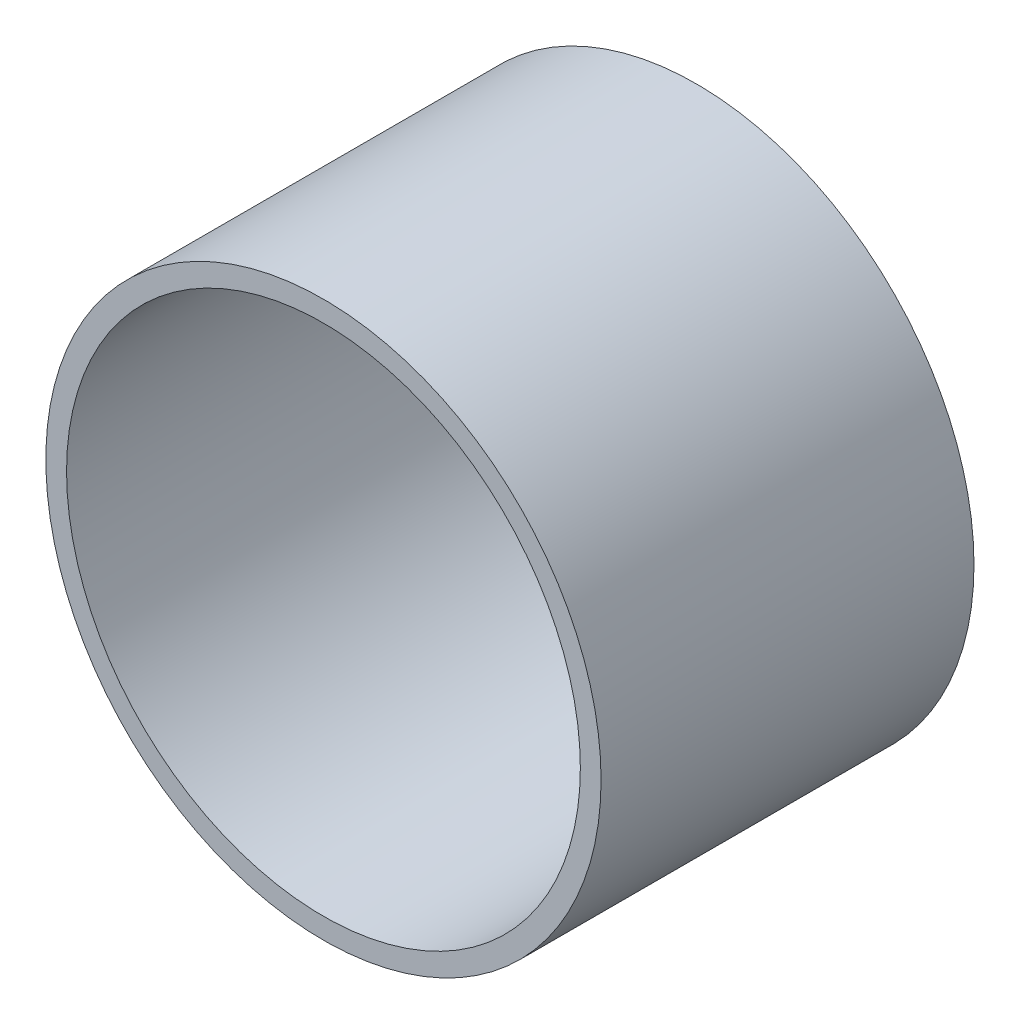
ISO-10303-21;
HEADER;
FILE_DESCRIPTION(('STEP AP214'),'2;1');
FILE_NAME('part.step','',(''),(''),'','','');
FILE_SCHEMA(('AUTOMOTIVE_DESIGN { 1 0 10303 214 1 1 1 1 }'));
ENDSEC;
DATA;
#1=APPLICATION_CONTEXT('core data for automotive mechanical design processes');
#2=APPLICATION_PROTOCOL_DEFINITION('international standard','automotive_design',2000,#1);
#3=PRODUCT_CONTEXT('',#1,'mechanical');
#4=PRODUCT('Part','Part','',(#3));
#5=PRODUCT_RELATED_PRODUCT_CATEGORY('part','',(#4));
#6=PRODUCT_DEFINITION_FORMATION('','',#4);
#7=PRODUCT_DEFINITION_CONTEXT('part definition',#1,'design');
#8=PRODUCT_DEFINITION('design','',#6,#7);
#9=PRODUCT_DEFINITION_SHAPE('','',#8);
#10=(LENGTH_UNIT() NAMED_UNIT(*) SI_UNIT(.MILLI.,.METRE.));
#11=(NAMED_UNIT(*) PLANE_ANGLE_UNIT() SI_UNIT($,.RADIAN.));
#12=(NAMED_UNIT(*) SI_UNIT($,.STERADIAN.) SOLID_ANGLE_UNIT());
#13=UNCERTAINTY_MEASURE_WITH_UNIT(LENGTH_MEASURE(1.E-05),#10,'distance_accuracy_value','');
#14=(GEOMETRIC_REPRESENTATION_CONTEXT(3) GLOBAL_UNCERTAINTY_ASSIGNED_CONTEXT((#13)) GLOBAL_UNIT_ASSIGNED_CONTEXT((#10,
#11,#12)) REPRESENTATION_CONTEXT('',''));
#15=CARTESIAN_POINT('',(0.,0.,0.));
#16=DIRECTION('',(0.,0.,1.));
#17=DIRECTION('',(1.,0.,0.));
#18=AXIS2_PLACEMENT_3D('',#15,#16,#17);
#19=CARTESIAN_POINT('',(0.,0.,-117.252308678997));
#20=DIRECTION('',(0.,0.,1.));
#21=DIRECTION('',(1.,0.,0.));
#22=AXIS2_PLACEMENT_3D('',#19,#20,#21);
#23=CYLINDRICAL_SURFACE('',#22,33.5);
#24=CARTESIAN_POINT('',(0.,0.,-22.5));
#25=DIRECTION('',(0.,0.,1.));
#26=DIRECTION('',(1.,0.,0.));
#27=AXIS2_PLACEMENT_3D('',#24,#25,#26);
#28=CIRCLE('',#27,33.5);
#29=CARTESIAN_POINT('',(33.5,0.,-22.5));
#30=VERTEX_POINT('',#29);
#31=EDGE_CURVE('E11',#30,#30,#28,.F.);
#32=ORIENTED_EDGE('',*,*,#31,.F.);
#33=EDGE_LOOP('',(#32));
#34=FACE_BOUND('',#33,.T.);
#35=CARTESIAN_POINT('',(0.,0.,22.5));
#36=DIRECTION('',(0.,0.,1.));
#37=DIRECTION('',(1.,0.,0.));
#38=AXIS2_PLACEMENT_3D('',#35,#36,#37);
#39=CIRCLE('',#38,33.5);
#40=CARTESIAN_POINT('',(33.5,0.,22.5));
#41=VERTEX_POINT('',#40);
#42=EDGE_CURVE('E54',#41,#41,#39,.T.);
#43=ORIENTED_EDGE('',*,*,#42,.F.);
#44=EDGE_LOOP('',(#43));
#45=FACE_BOUND('',#44,.T.);
#46=ADVANCED_FACE('F43',(#34,#45),#23,.T.);
#47=CARTESIAN_POINT('',(0.,0.,22.5));
#48=DIRECTION('',(0.,0.,1.));
#49=DIRECTION('',(1.,0.,0.));
#50=AXIS2_PLACEMENT_3D('',#47,#48,#49);
#51=PLANE('',#50);
#52=CARTESIAN_POINT('',(0.,0.,22.5));
#53=DIRECTION('',(0.,0.,1.));
#54=DIRECTION('',(1.,0.,0.));
#55=AXIS2_PLACEMENT_3D('',#52,#53,#54);
#56=CIRCLE('',#55,31.);
#57=CARTESIAN_POINT('',(31.,0.,22.5));
#58=VERTEX_POINT('',#57);
#59=EDGE_CURVE('E56',#58,#58,#56,.T.);
#60=ORIENTED_EDGE('',*,*,#59,.F.);
#61=EDGE_LOOP('',(#60));
#62=FACE_BOUND('',#61,.T.);
#63=ORIENTED_EDGE('',*,*,#42,.T.);
#64=EDGE_LOOP('',(#63));
#65=FACE_BOUND('',#64,.T.);
#66=ADVANCED_FACE('F61',(#62,#65),#51,.T.);
#67=CARTESIAN_POINT('',(0.,0.,-117.252308678997));
#68=DIRECTION('',(0.,0.,1.));
#69=DIRECTION('',(1.,0.,0.));
#70=AXIS2_PLACEMENT_3D('',#67,#68,#69);
#71=CYLINDRICAL_SURFACE('',#70,31.);
#72=CARTESIAN_POINT('',(0.,0.,-22.5));
#73=DIRECTION('',(0.,0.,1.));
#74=DIRECTION('',(1.,0.,0.));
#75=AXIS2_PLACEMENT_3D('',#72,#73,#74);
#76=CIRCLE('',#75,31.);
#77=CARTESIAN_POINT('',(31.,0.,-22.5));
#78=VERTEX_POINT('',#77);
#79=EDGE_CURVE('E46',#78,#78,#76,.F.);
#80=ORIENTED_EDGE('',*,*,#79,.T.);
#81=EDGE_LOOP('',(#80));
#82=FACE_BOUND('',#81,.T.);
#83=ORIENTED_EDGE('',*,*,#59,.T.);
#84=EDGE_LOOP('',(#83));
#85=FACE_BOUND('',#84,.T.);
#86=ADVANCED_FACE('F68',(#82,#85),#71,.F.);
#87=CARTESIAN_POINT('',(0.,0.,-22.5));
#88=DIRECTION('',(0.,0.,1.));
#89=DIRECTION('',(1.,0.,0.));
#90=AXIS2_PLACEMENT_3D('',#87,#88,#89);
#91=PLANE('',#90);
#92=ORIENTED_EDGE('',*,*,#31,.T.);
#93=EDGE_LOOP('',(#92));
#94=FACE_BOUND('',#93,.T.);
#95=ORIENTED_EDGE('',*,*,#79,.F.);
#96=EDGE_LOOP('',(#95));
#97=FACE_BOUND('',#96,.T.);
#98=ADVANCED_FACE('F73',(#94,#97),#91,.F.);
#99=CLOSED_SHELL('',(#46,#66,#86,#98));
#100=MANIFOLD_SOLID_BREP('B2',#99);
#101=ADVANCED_BREP_SHAPE_REPRESENTATION('',(#18,#100),#14);
#102=SHAPE_DEFINITION_REPRESENTATION(#9,#101);
ENDSEC;
END-ISO-10303-21;
